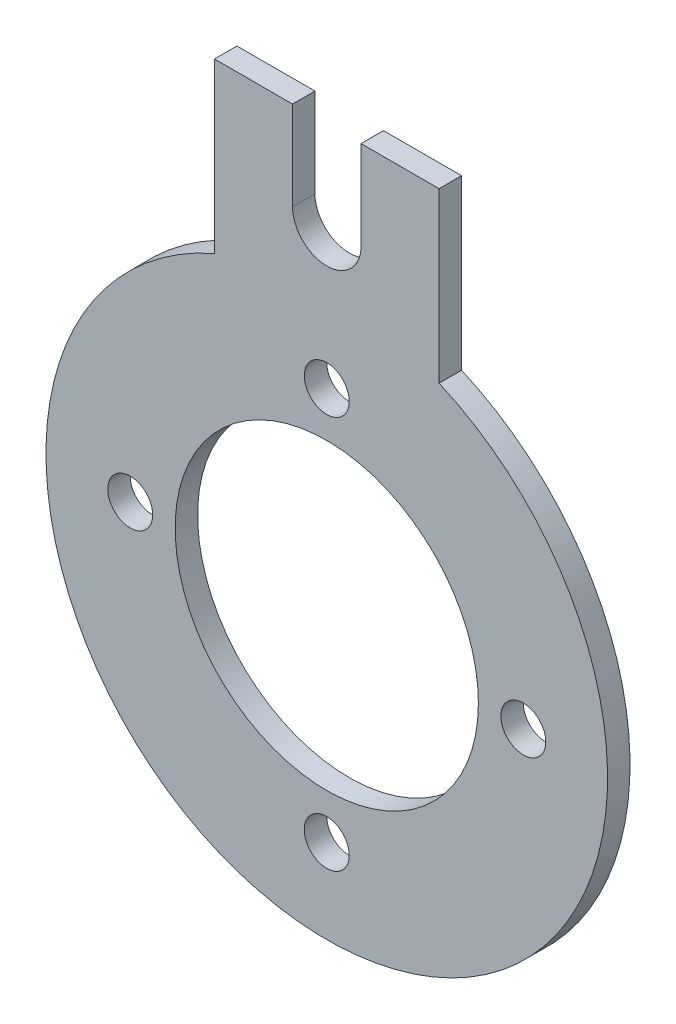
ISO-10303-21;
HEADER;
FILE_DESCRIPTION(('STEP AP214'),'2;1');
FILE_NAME('part.step','',(''),(''),'','','');
FILE_SCHEMA(('AUTOMOTIVE_DESIGN { 1 0 10303 214 1 1 1 1 }'));
ENDSEC;
DATA;
#1=APPLICATION_CONTEXT('core data for automotive mechanical design processes');
#2=APPLICATION_PROTOCOL_DEFINITION('international standard','automotive_design',2000,#1);
#3=PRODUCT_CONTEXT('',#1,'mechanical');
#4=PRODUCT('Part','Part','',(#3));
#5=PRODUCT_RELATED_PRODUCT_CATEGORY('part','',(#4));
#6=PRODUCT_DEFINITION_FORMATION('','',#4);
#7=PRODUCT_DEFINITION_CONTEXT('part definition',#1,'design');
#8=PRODUCT_DEFINITION('design','',#6,#7);
#9=PRODUCT_DEFINITION_SHAPE('','',#8);
#10=(LENGTH_UNIT() NAMED_UNIT(*) SI_UNIT(.MILLI.,.METRE.));
#11=(NAMED_UNIT(*) PLANE_ANGLE_UNIT() SI_UNIT($,.RADIAN.));
#12=(NAMED_UNIT(*) SI_UNIT($,.STERADIAN.) SOLID_ANGLE_UNIT());
#13=UNCERTAINTY_MEASURE_WITH_UNIT(LENGTH_MEASURE(1.E-05),#10,'distance_accuracy_value','');
#14=(GEOMETRIC_REPRESENTATION_CONTEXT(3) GLOBAL_UNCERTAINTY_ASSIGNED_CONTEXT((#13)) GLOBAL_UNIT_ASSIGNED_CONTEXT((#10,
#11,#12)) REPRESENTATION_CONTEXT('',''));
#15=CARTESIAN_POINT('',(0.,0.,0.));
#16=DIRECTION('',(0.,0.,1.));
#17=DIRECTION('',(1.,0.,0.));
#18=AXIS2_PLACEMENT_3D('',#15,#16,#17);
#19=CARTESIAN_POINT('',(0.,0.,2.));
#20=DIRECTION('',(0.,0.,1.));
#21=DIRECTION('',(1.,0.,0.));
#22=AXIS2_PLACEMENT_3D('',#19,#20,#21);
#23=PLANE('',#22);
#24=CARTESIAN_POINT('',(0.,0.,2.));
#25=DIRECTION('',(0.,0.,1.));
#26=DIRECTION('',(1.,0.,0.));
#27=AXIS2_PLACEMENT_3D('',#24,#25,#26);
#28=CIRCLE('',#27,13.5);
#29=CARTESIAN_POINT('',(13.5,0.,2.));
#30=VERTEX_POINT('',#29);
#31=EDGE_CURVE('E213',#30,#30,#28,.T.);
#32=ORIENTED_EDGE('',*,*,#31,.F.);
#33=EDGE_LOOP('',(#32));
#34=FACE_BOUND('',#33,.T.);
#35=CARTESIAN_POINT('',(9.90473566267125E-13,-17.5,2.));
#36=DIRECTION('',(0.,0.,1.));
#37=DIRECTION('',(1.,0.,0.));
#38=AXIS2_PLACEMENT_3D('',#35,#36,#37);
#39=CIRCLE('',#38,2.00000000000106);
#40=CARTESIAN_POINT('',(2.00000000000205,-17.5,2.));
#41=VERTEX_POINT('',#40);
#42=EDGE_CURVE('E171',#41,#41,#39,.T.);
#43=ORIENTED_EDGE('',*,*,#42,.F.);
#44=EDGE_LOOP('',(#43));
#45=FACE_BOUND('',#44,.T.);
#46=CARTESIAN_POINT('',(0.,17.5,2.));
#47=DIRECTION('',(0.,0.,1.));
#48=DIRECTION('',(1.,0.,0.));
#49=AXIS2_PLACEMENT_3D('',#46,#47,#48);
#50=CIRCLE('',#49,2.);
#51=CARTESIAN_POINT('',(2.,17.5,2.));
#52=VERTEX_POINT('',#51);
#53=EDGE_CURVE('E183',#52,#52,#50,.T.);
#54=ORIENTED_EDGE('',*,*,#53,.F.);
#55=EDGE_LOOP('',(#54));
#56=FACE_BOUND('',#55,.T.);
#57=CARTESIAN_POINT('',(0.,0.,2.));
#58=DIRECTION('',(0.,0.,1.));
#59=DIRECTION('',(1.,0.,0.));
#60=AXIS2_PLACEMENT_3D('',#57,#58,#59);
#61=CIRCLE('',#60,25.);
#62=CARTESIAN_POINT('',(-10.,22.9128784747792,2.));
#63=VERTEX_POINT('',#62);
#64=CARTESIAN_POINT('',(10.,22.9128784747792,2.));
#65=VERTEX_POINT('',#64);
#66=EDGE_CURVE('E11',#63,#65,#61,.T.);
#67=ORIENTED_EDGE('',*,*,#66,.T.);
#68=DIRECTION('',(0.,1.,0.));
#69=VECTOR('',#68,1.);
#70=CARTESIAN_POINT('',(10.,22.9128784747792,2.));
#71=LINE('',#70,#69);
#72=CARTESIAN_POINT('',(10.,37.9128784747792,2.));
#73=VERTEX_POINT('',#72);
#74=EDGE_CURVE('E135',#65,#73,#71,.T.);
#75=ORIENTED_EDGE('',*,*,#74,.T.);
#76=DIRECTION('',(-1.,0.,0.));
#77=VECTOR('',#76,1.);
#78=CARTESIAN_POINT('',(3.05,37.9128784747792,2.));
#79=LINE('',#78,#77);
#80=CARTESIAN_POINT('',(3.05,37.9128784747792,2.));
#81=VERTEX_POINT('',#80);
#82=EDGE_CURVE('E138',#73,#81,#79,.T.);
#83=ORIENTED_EDGE('',*,*,#82,.T.);
#84=DIRECTION('',(0.,-1.,0.));
#85=VECTOR('',#84,1.);
#86=CARTESIAN_POINT('',(3.05,30.,2.));
#87=LINE('',#86,#85);
#88=CARTESIAN_POINT('',(3.05,30.,2.));
#89=VERTEX_POINT('',#88);
#90=EDGE_CURVE('E142',#81,#89,#87,.T.);
#91=ORIENTED_EDGE('',*,*,#90,.T.);
#92=CARTESIAN_POINT('',(0.,30.,2.));
#93=DIRECTION('',(0.,0.,-1.));
#94=DIRECTION('',(1.,0.,0.));
#95=AXIS2_PLACEMENT_3D('',#92,#93,#94);
#96=CIRCLE('',#95,3.05);
#97=CARTESIAN_POINT('',(-3.05,30.,2.));
#98=VERTEX_POINT('',#97);
#99=EDGE_CURVE('E145',#89,#98,#96,.T.);
#100=ORIENTED_EDGE('',*,*,#99,.T.);
#101=DIRECTION('',(0.,1.,0.));
#102=VECTOR('',#101,1.);
#103=CARTESIAN_POINT('',(-3.05,30.,2.));
#104=LINE('',#103,#102);
#105=CARTESIAN_POINT('',(-3.05,37.9128784747792,2.));
#106=VERTEX_POINT('',#105);
#107=EDGE_CURVE('E148',#98,#106,#104,.T.);
#108=ORIENTED_EDGE('',*,*,#107,.T.);
#109=DIRECTION('',(-1.,0.,0.));
#110=VECTOR('',#109,1.);
#111=CARTESIAN_POINT('',(-10.,37.9128784747792,2.));
#112=LINE('',#111,#110);
#113=CARTESIAN_POINT('',(-10.,37.9128784747792,2.));
#114=VERTEX_POINT('',#113);
#115=EDGE_CURVE('E111',#106,#114,#112,.T.);
#116=ORIENTED_EDGE('',*,*,#115,.T.);
#117=DIRECTION('',(0.,-1.,0.));
#118=VECTOR('',#117,1.);
#119=CARTESIAN_POINT('',(-10.,22.9128784747792,2.));
#120=LINE('',#119,#118);
#121=EDGE_CURVE('E49',#114,#63,#120,.T.);
#122=ORIENTED_EDGE('',*,*,#121,.T.);
#123=EDGE_LOOP('',(#67,#75,#83,#91,#100,#108,#116,#122));
#124=FACE_BOUND('',#123,.T.);
#125=CARTESIAN_POINT('',(17.5000000000005,4.95236783133562E-13,2.));
#126=DIRECTION('',(0.,0.,1.));
#127=DIRECTION('',(1.,0.,0.));
#128=AXIS2_PLACEMENT_3D('',#125,#126,#127);
#129=CIRCLE('',#128,2.00000000000039);
#130=CARTESIAN_POINT('',(19.5000000000009,4.95236783133562E-13,2.));
#131=VERTEX_POINT('',#130);
#132=EDGE_CURVE('E177',#131,#131,#129,.T.);
#133=ORIENTED_EDGE('',*,*,#132,.F.);
#134=EDGE_LOOP('',(#133));
#135=FACE_BOUND('',#134,.T.);
#136=CARTESIAN_POINT('',(-17.4999999999995,-4.9737991503207E-13,2.));
#137=DIRECTION('',(0.,0.,1.));
#138=DIRECTION('',(1.,0.,0.));
#139=AXIS2_PLACEMENT_3D('',#136,#137,#138);
#140=CIRCLE('',#139,2.0000000000008);
#141=CARTESIAN_POINT('',(-15.4999999999987,-4.9737991503207E-13,2.));
#142=VERTEX_POINT('',#141);
#143=EDGE_CURVE('E165',#142,#142,#140,.T.);
#144=ORIENTED_EDGE('',*,*,#143,.F.);
#145=EDGE_LOOP('',(#144));
#146=FACE_BOUND('',#145,.T.);
#147=ADVANCED_FACE('F35',(#34,#45,#56,#124,#135,#146),#23,.T.);
#148=CARTESIAN_POINT('',(0.,0.,0.));
#149=DIRECTION('',(0.,0.,1.));
#150=DIRECTION('',(1.,0.,0.));
#151=AXIS2_PLACEMENT_3D('',#148,#149,#150);
#152=PLANE('',#151);
#153=CARTESIAN_POINT('',(0.,0.,0.));
#154=DIRECTION('',(0.,0.,1.));
#155=DIRECTION('',(1.,0.,0.));
#156=AXIS2_PLACEMENT_3D('',#153,#154,#155);
#157=CIRCLE('',#156,13.5);
#158=CARTESIAN_POINT('',(13.5,0.,0.));
#159=VERTEX_POINT('',#158);
#160=EDGE_CURVE('E139',#159,#159,#157,.T.);
#161=ORIENTED_EDGE('',*,*,#160,.T.);
#162=EDGE_LOOP('',(#161));
#163=FACE_BOUND('',#162,.T.);
#164=CARTESIAN_POINT('',(0.,0.,0.));
#165=DIRECTION('',(0.,0.,1.));
#166=DIRECTION('',(1.,0.,0.));
#167=AXIS2_PLACEMENT_3D('',#164,#165,#166);
#168=CIRCLE('',#167,25.);
#169=CARTESIAN_POINT('',(-10.,22.9128784747792,0.));
#170=VERTEX_POINT('',#169);
#171=CARTESIAN_POINT('',(10.,22.9128784747792,0.));
#172=VERTEX_POINT('',#171);
#173=EDGE_CURVE('E39',#170,#172,#168,.T.);
#174=ORIENTED_EDGE('',*,*,#173,.F.);
#175=DIRECTION('',(0.,-1.,0.));
#176=VECTOR('',#175,1.);
#177=CARTESIAN_POINT('',(-10.,22.9128784747792,0.));
#178=LINE('',#177,#176);
#179=CARTESIAN_POINT('',(-10.,37.9128784747792,0.));
#180=VERTEX_POINT('',#179);
#181=EDGE_CURVE('E57',#180,#170,#178,.T.);
#182=ORIENTED_EDGE('',*,*,#181,.F.);
#183=DIRECTION('',(-1.,0.,0.));
#184=VECTOR('',#183,1.);
#185=CARTESIAN_POINT('',(-10.,37.9128784747792,0.));
#186=LINE('',#185,#184);
#187=CARTESIAN_POINT('',(-3.05,37.9128784747792,0.));
#188=VERTEX_POINT('',#187);
#189=EDGE_CURVE('E110',#188,#180,#186,.T.);
#190=ORIENTED_EDGE('',*,*,#189,.F.);
#191=DIRECTION('',(0.,1.,0.));
#192=VECTOR('',#191,1.);
#193=CARTESIAN_POINT('',(-3.05,30.,0.));
#194=LINE('',#193,#192);
#195=CARTESIAN_POINT('',(-3.05,30.,0.));
#196=VERTEX_POINT('',#195);
#197=EDGE_CURVE('E124',#196,#188,#194,.T.);
#198=ORIENTED_EDGE('',*,*,#197,.F.);
#199=CARTESIAN_POINT('',(0.,30.,0.));
#200=DIRECTION('',(0.,0.,-1.));
#201=DIRECTION('',(1.,0.,0.));
#202=AXIS2_PLACEMENT_3D('',#199,#200,#201);
#203=CIRCLE('',#202,3.05);
#204=CARTESIAN_POINT('',(3.05,30.,0.));
#205=VERTEX_POINT('',#204);
#206=EDGE_CURVE('E128',#205,#196,#203,.T.);
#207=ORIENTED_EDGE('',*,*,#206,.F.);
#208=DIRECTION('',(0.,-1.,0.));
#209=VECTOR('',#208,1.);
#210=CARTESIAN_POINT('',(3.05,30.,0.));
#211=LINE('',#210,#209);
#212=CARTESIAN_POINT('',(3.05,37.9128784747792,0.));
#213=VERTEX_POINT('',#212);
#214=EDGE_CURVE('E130',#213,#205,#211,.T.);
#215=ORIENTED_EDGE('',*,*,#214,.F.);
#216=DIRECTION('',(-1.,0.,0.));
#217=VECTOR('',#216,1.);
#218=CARTESIAN_POINT('',(3.05,37.9128784747792,0.));
#219=LINE('',#218,#217);
#220=CARTESIAN_POINT('',(10.,37.9128784747792,0.));
#221=VERTEX_POINT('',#220);
#222=EDGE_CURVE('E269',#221,#213,#219,.T.);
#223=ORIENTED_EDGE('',*,*,#222,.F.);
#224=DIRECTION('',(0.,1.,0.));
#225=VECTOR('',#224,1.);
#226=CARTESIAN_POINT('',(10.,22.9128784747792,0.));
#227=LINE('',#226,#225);
#228=EDGE_CURVE('E152',#172,#221,#227,.T.);
#229=ORIENTED_EDGE('',*,*,#228,.F.);
#230=EDGE_LOOP('',(#174,#182,#190,#198,#207,#215,#223,#229));
#231=FACE_BOUND('',#230,.T.);
#232=CARTESIAN_POINT('',(0.,17.5,0.));
#233=DIRECTION('',(0.,0.,1.));
#234=DIRECTION('',(1.,0.,0.));
#235=AXIS2_PLACEMENT_3D('',#232,#233,#234);
#236=CIRCLE('',#235,2.);
#237=CARTESIAN_POINT('',(2.,17.5,0.));
#238=VERTEX_POINT('',#237);
#239=EDGE_CURVE('E180',#238,#238,#236,.T.);
#240=ORIENTED_EDGE('',*,*,#239,.T.);
#241=EDGE_LOOP('',(#240));
#242=FACE_BOUND('',#241,.T.);
#243=CARTESIAN_POINT('',(17.5000000000005,4.95236783133562E-13,0.));
#244=DIRECTION('',(0.,0.,1.));
#245=DIRECTION('',(1.,0.,0.));
#246=AXIS2_PLACEMENT_3D('',#243,#244,#245);
#247=CIRCLE('',#246,2.00000000000039);
#248=CARTESIAN_POINT('',(19.5000000000009,4.95236783133562E-13,0.));
#249=VERTEX_POINT('',#248);
#250=EDGE_CURVE('E174',#249,#249,#247,.T.);
#251=ORIENTED_EDGE('',*,*,#250,.T.);
#252=EDGE_LOOP('',(#251));
#253=FACE_BOUND('',#252,.T.);
#254=CARTESIAN_POINT('',(9.90473566267125E-13,-17.5,0.));
#255=DIRECTION('',(0.,0.,1.));
#256=DIRECTION('',(1.,0.,0.));
#257=AXIS2_PLACEMENT_3D('',#254,#255,#256);
#258=CIRCLE('',#257,2.00000000000106);
#259=CARTESIAN_POINT('',(2.00000000000205,-17.5,0.));
#260=VERTEX_POINT('',#259);
#261=EDGE_CURVE('E168',#260,#260,#258,.T.);
#262=ORIENTED_EDGE('',*,*,#261,.T.);
#263=EDGE_LOOP('',(#262));
#264=FACE_BOUND('',#263,.T.);
#265=CARTESIAN_POINT('',(-17.4999999999995,-4.9737991503207E-13,0.));
#266=DIRECTION('',(0.,0.,1.));
#267=DIRECTION('',(1.,0.,0.));
#268=AXIS2_PLACEMENT_3D('',#265,#266,#267);
#269=CIRCLE('',#268,2.0000000000008);
#270=CARTESIAN_POINT('',(-15.4999999999987,-4.9737991503207E-13,0.));
#271=VERTEX_POINT('',#270);
#272=EDGE_CURVE('E155',#271,#271,#269,.T.);
#273=ORIENTED_EDGE('',*,*,#272,.T.);
#274=EDGE_LOOP('',(#273));
#275=FACE_BOUND('',#274,.T.);
#276=ADVANCED_FACE('F121',(#163,#231,#242,#253,#264,#275),#152,.F.);
#277=CARTESIAN_POINT('',(0.,0.,2.));
#278=DIRECTION('',(0.,0.,-1.));
#279=DIRECTION('',(-1.,0.,0.));
#280=AXIS2_PLACEMENT_3D('',#277,#278,#279);
#281=CYLINDRICAL_SURFACE('',#280,25.);
#282=ORIENTED_EDGE('',*,*,#66,.F.);
#283=DIRECTION('',(0.,0.,1.));
#284=VECTOR('',#283,1.);
#285=CARTESIAN_POINT('',(-10.,22.9128784747792,0.));
#286=LINE('',#285,#284);
#287=EDGE_CURVE('E153',#170,#63,#286,.T.);
#288=ORIENTED_EDGE('',*,*,#287,.F.);
#289=ORIENTED_EDGE('',*,*,#173,.T.);
#290=DIRECTION('',(0.,0.,1.));
#291=VECTOR('',#290,1.);
#292=CARTESIAN_POINT('',(10.,22.9128784747792,0.));
#293=LINE('',#292,#291);
#294=EDGE_CURVE('E93',#172,#65,#293,.T.);
#295=ORIENTED_EDGE('',*,*,#294,.T.);
#296=EDGE_LOOP('',(#282,#288,#289,#295));
#297=FACE_BOUND('',#296,.T.);
#298=ADVANCED_FACE('F37',(#297),#281,.T.);
#299=CARTESIAN_POINT('',(0.,17.5,2.));
#300=DIRECTION('',(0.,0.,-1.));
#301=DIRECTION('',(-1.,0.,0.));
#302=AXIS2_PLACEMENT_3D('',#299,#300,#301);
#303=CYLINDRICAL_SURFACE('',#302,2.);
#304=ORIENTED_EDGE('',*,*,#53,.T.);
#305=EDGE_LOOP('',(#304));
#306=FACE_BOUND('',#305,.T.);
#307=ORIENTED_EDGE('',*,*,#239,.F.);
#308=EDGE_LOOP('',(#307));
#309=FACE_BOUND('',#308,.T.);
#310=ADVANCED_FACE('F190',(#306,#309),#303,.F.);
#311=CARTESIAN_POINT('',(17.5000000000005,4.95236783133562E-13,2.));
#312=DIRECTION('',(0.,0.,-1.));
#313=DIRECTION('',(-1.,0.,0.));
#314=AXIS2_PLACEMENT_3D('',#311,#312,#313);
#315=CYLINDRICAL_SURFACE('',#314,2.00000000000039);
#316=ORIENTED_EDGE('',*,*,#132,.T.);
#317=EDGE_LOOP('',(#316));
#318=FACE_BOUND('',#317,.T.);
#319=ORIENTED_EDGE('',*,*,#250,.F.);
#320=EDGE_LOOP('',(#319));
#321=FACE_BOUND('',#320,.T.);
#322=ADVANCED_FACE('F192',(#318,#321),#315,.F.);
#323=CARTESIAN_POINT('',(9.90473566267125E-13,-17.5,2.));
#324=DIRECTION('',(0.,0.,-1.));
#325=DIRECTION('',(-1.,0.,0.));
#326=AXIS2_PLACEMENT_3D('',#323,#324,#325);
#327=CYLINDRICAL_SURFACE('',#326,2.00000000000106);
#328=ORIENTED_EDGE('',*,*,#42,.T.);
#329=EDGE_LOOP('',(#328));
#330=FACE_BOUND('',#329,.T.);
#331=ORIENTED_EDGE('',*,*,#261,.F.);
#332=EDGE_LOOP('',(#331));
#333=FACE_BOUND('',#332,.T.);
#334=ADVANCED_FACE('F199',(#330,#333),#327,.F.);
#335=CARTESIAN_POINT('',(-17.4999999999995,-4.9737991503207E-13,2.));
#336=DIRECTION('',(0.,0.,-1.));
#337=DIRECTION('',(-1.,0.,0.));
#338=AXIS2_PLACEMENT_3D('',#335,#336,#337);
#339=CYLINDRICAL_SURFACE('',#338,2.0000000000008);
#340=ORIENTED_EDGE('',*,*,#143,.T.);
#341=EDGE_LOOP('',(#340));
#342=FACE_BOUND('',#341,.T.);
#343=ORIENTED_EDGE('',*,*,#272,.F.);
#344=EDGE_LOOP('',(#343));
#345=FACE_BOUND('',#344,.T.);
#346=ADVANCED_FACE('F223',(#342,#345),#339,.F.);
#347=CARTESIAN_POINT('',(-10.,22.9128784747792,0.));
#348=DIRECTION('',(-1.,0.,0.));
#349=DIRECTION('',(0.,-1.,0.));
#350=AXIS2_PLACEMENT_3D('',#347,#348,#349);
#351=PLANE('',#350);
#352=ORIENTED_EDGE('',*,*,#121,.F.);
#353=DIRECTION('',(0.,0.,1.));
#354=VECTOR('',#353,1.);
#355=CARTESIAN_POINT('',(-10.,37.9128784747792,0.));
#356=LINE('',#355,#354);
#357=EDGE_CURVE('E86',#180,#114,#356,.T.);
#358=ORIENTED_EDGE('',*,*,#357,.F.);
#359=ORIENTED_EDGE('',*,*,#181,.T.);
#360=ORIENTED_EDGE('',*,*,#287,.T.);
#361=EDGE_LOOP('',(#352,#358,#359,#360));
#362=FACE_BOUND('',#361,.T.);
#363=ADVANCED_FACE('F226',(#362),#351,.T.);
#364=CARTESIAN_POINT('',(-10.,37.9128784747792,0.));
#365=DIRECTION('',(0.,1.,0.));
#366=DIRECTION('',(0.,0.,1.));
#367=AXIS2_PLACEMENT_3D('',#364,#365,#366);
#368=PLANE('',#367);
#369=ORIENTED_EDGE('',*,*,#115,.F.);
#370=DIRECTION('',(0.,0.,1.));
#371=VECTOR('',#370,1.);
#372=CARTESIAN_POINT('',(-3.05,37.9128784747792,0.));
#373=LINE('',#372,#371);
#374=EDGE_CURVE('E107',#188,#106,#373,.T.);
#375=ORIENTED_EDGE('',*,*,#374,.F.);
#376=ORIENTED_EDGE('',*,*,#189,.T.);
#377=ORIENTED_EDGE('',*,*,#357,.T.);
#378=EDGE_LOOP('',(#369,#375,#376,#377));
#379=FACE_BOUND('',#378,.T.);
#380=ADVANCED_FACE('F109',(#379),#368,.T.);
#381=CARTESIAN_POINT('',(-3.05,30.,0.));
#382=DIRECTION('',(1.,0.,0.));
#383=DIRECTION('',(0.,0.,-1.));
#384=AXIS2_PLACEMENT_3D('',#381,#382,#383);
#385=PLANE('',#384);
#386=ORIENTED_EDGE('',*,*,#107,.F.);
#387=DIRECTION('',(0.,0.,1.));
#388=VECTOR('',#387,1.);
#389=CARTESIAN_POINT('',(-3.05,30.,0.));
#390=LINE('',#389,#388);
#391=EDGE_CURVE('E116',#196,#98,#390,.T.);
#392=ORIENTED_EDGE('',*,*,#391,.F.);
#393=ORIENTED_EDGE('',*,*,#197,.T.);
#394=ORIENTED_EDGE('',*,*,#374,.T.);
#395=EDGE_LOOP('',(#386,#392,#393,#394));
#396=FACE_BOUND('',#395,.T.);
#397=ADVANCED_FACE('F127',(#396),#385,.T.);
#398=CARTESIAN_POINT('',(0.,30.,0.));
#399=DIRECTION('',(0.,0.,1.));
#400=DIRECTION('',(1.,0.,0.));
#401=AXIS2_PLACEMENT_3D('',#398,#399,#400);
#402=CYLINDRICAL_SURFACE('',#401,3.05);
#403=ORIENTED_EDGE('',*,*,#99,.F.);
#404=DIRECTION('',(0.,0.,1.));
#405=VECTOR('',#404,1.);
#406=CARTESIAN_POINT('',(3.05,30.,0.));
#407=LINE('',#406,#405);
#408=EDGE_CURVE('E158',#205,#89,#407,.T.);
#409=ORIENTED_EDGE('',*,*,#408,.F.);
#410=ORIENTED_EDGE('',*,*,#206,.T.);
#411=ORIENTED_EDGE('',*,*,#391,.T.);
#412=EDGE_LOOP('',(#403,#409,#410,#411));
#413=FACE_BOUND('',#412,.T.);
#414=ADVANCED_FACE('F249',(#413),#402,.F.);
#415=CARTESIAN_POINT('',(3.05,30.,0.));
#416=DIRECTION('',(-1.,0.,0.));
#417=DIRECTION('',(0.,0.,1.));
#418=AXIS2_PLACEMENT_3D('',#415,#416,#417);
#419=PLANE('',#418);
#420=ORIENTED_EDGE('',*,*,#90,.F.);
#421=DIRECTION('',(0.,0.,1.));
#422=VECTOR('',#421,1.);
#423=CARTESIAN_POINT('',(3.05,37.9128784747792,0.));
#424=LINE('',#423,#422);
#425=EDGE_CURVE('E160',#213,#81,#424,.T.);
#426=ORIENTED_EDGE('',*,*,#425,.F.);
#427=ORIENTED_EDGE('',*,*,#214,.T.);
#428=ORIENTED_EDGE('',*,*,#408,.T.);
#429=EDGE_LOOP('',(#420,#426,#427,#428));
#430=FACE_BOUND('',#429,.T.);
#431=ADVANCED_FACE('F245',(#430),#419,.T.);
#432=CARTESIAN_POINT('',(3.05,37.9128784747792,0.));
#433=DIRECTION('',(0.,1.,0.));
#434=DIRECTION('',(0.,0.,1.));
#435=AXIS2_PLACEMENT_3D('',#432,#433,#434);
#436=PLANE('',#435);
#437=ORIENTED_EDGE('',*,*,#82,.F.);
#438=DIRECTION('',(0.,0.,1.));
#439=VECTOR('',#438,1.);
#440=CARTESIAN_POINT('',(10.,37.9128784747792,0.));
#441=LINE('',#440,#439);
#442=EDGE_CURVE('E162',#221,#73,#441,.T.);
#443=ORIENTED_EDGE('',*,*,#442,.F.);
#444=ORIENTED_EDGE('',*,*,#222,.T.);
#445=ORIENTED_EDGE('',*,*,#425,.T.);
#446=EDGE_LOOP('',(#437,#443,#444,#445));
#447=FACE_BOUND('',#446,.T.);
#448=ADVANCED_FACE('F242',(#447),#436,.T.);
#449=CARTESIAN_POINT('',(10.,22.9128784747792,0.));
#450=DIRECTION('',(1.,0.,0.));
#451=DIRECTION('',(0.,0.,-1.));
#452=AXIS2_PLACEMENT_3D('',#449,#450,#451);
#453=PLANE('',#452);
#454=ORIENTED_EDGE('',*,*,#74,.F.);
#455=ORIENTED_EDGE('',*,*,#294,.F.);
#456=ORIENTED_EDGE('',*,*,#228,.T.);
#457=ORIENTED_EDGE('',*,*,#442,.T.);
#458=EDGE_LOOP('',(#454,#455,#456,#457));
#459=FACE_BOUND('',#458,.T.);
#460=ADVANCED_FACE('F238',(#459),#453,.T.);
#461=CARTESIAN_POINT('',(0.,0.,0.));
#462=DIRECTION('',(0.,0.,1.));
#463=DIRECTION('',(1.,0.,0.));
#464=AXIS2_PLACEMENT_3D('',#461,#462,#463);
#465=CYLINDRICAL_SURFACE('',#464,13.5);
#466=ORIENTED_EDGE('',*,*,#160,.F.);
#467=EDGE_LOOP('',(#466));
#468=FACE_BOUND('',#467,.T.);
#469=ORIENTED_EDGE('',*,*,#31,.T.);
#470=EDGE_LOOP('',(#469));
#471=FACE_BOUND('',#470,.T.);
#472=ADVANCED_FACE('F241',(#468,#471),#465,.F.);
#473=CLOSED_SHELL('',(#147,#276,#298,#310,#322,#334,#346,#363,#380,#397,#414,#431,#448,#460,#472));
#474=MANIFOLD_SOLID_BREP('B2',#473);
#475=ADVANCED_BREP_SHAPE_REPRESENTATION('',(#18,#474),#14);
#476=SHAPE_DEFINITION_REPRESENTATION(#9,#475);
ENDSEC;
END-ISO-10303-21;
